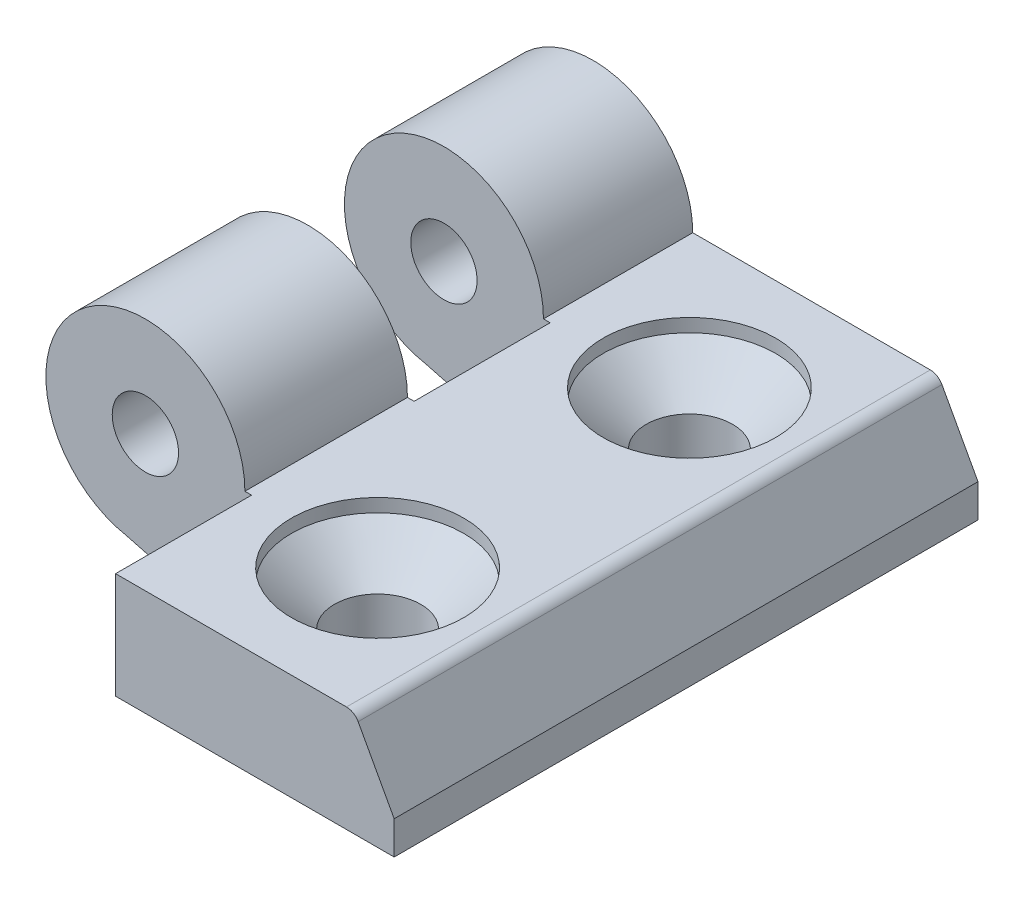
ISO-10303-21;
HEADER;
FILE_DESCRIPTION(('STEP AP214'),'2;1');
FILE_NAME('part.step','',(''),(''),'','','');
FILE_SCHEMA(('AUTOMOTIVE_DESIGN { 1 0 10303 214 1 1 1 1 }'));
ENDSEC;
DATA;
#1=APPLICATION_CONTEXT('core data for automotive mechanical design processes');
#2=APPLICATION_PROTOCOL_DEFINITION('international standard','automotive_design',2000,#1);
#3=PRODUCT_CONTEXT('',#1,'mechanical');
#4=PRODUCT('Part','Part','',(#3));
#5=PRODUCT_RELATED_PRODUCT_CATEGORY('part','',(#4));
#6=PRODUCT_DEFINITION_FORMATION('','',#4);
#7=PRODUCT_DEFINITION_CONTEXT('part definition',#1,'design');
#8=PRODUCT_DEFINITION('design','',#6,#7);
#9=PRODUCT_DEFINITION_SHAPE('','',#8);
#10=(LENGTH_UNIT() NAMED_UNIT(*) SI_UNIT(.MILLI.,.METRE.));
#11=(NAMED_UNIT(*) PLANE_ANGLE_UNIT() SI_UNIT($,.RADIAN.));
#12=(NAMED_UNIT(*) SI_UNIT($,.STERADIAN.) SOLID_ANGLE_UNIT());
#13=UNCERTAINTY_MEASURE_WITH_UNIT(LENGTH_MEASURE(1.E-05),#10,'distance_accuracy_value','');
#14=(GEOMETRIC_REPRESENTATION_CONTEXT(3) GLOBAL_UNCERTAINTY_ASSIGNED_CONTEXT((#13)) GLOBAL_UNIT_ASSIGNED_CONTEXT((#10,
#11,#12)) REPRESENTATION_CONTEXT('',''));
#15=CARTESIAN_POINT('',(0.,0.,0.));
#16=DIRECTION('',(0.,0.,1.));
#17=DIRECTION('',(1.,0.,0.));
#18=AXIS2_PLACEMENT_3D('',#15,#16,#17);
#19=CARTESIAN_POINT('',(0.,0.,22.));
#20=DIRECTION('',(0.,0.,-1.));
#21=DIRECTION('',(-1.,0.,0.));
#22=AXIS2_PLACEMENT_3D('',#19,#20,#21);
#23=CYLINDRICAL_SURFACE('',#22,7.5);
#24=DIRECTION('',(0.,0.,-1.));
#25=VECTOR('',#24,1.);
#26=CARTESIAN_POINT('',(7.5,0.,22.));
#27=LINE('',#26,#25);
#28=CARTESIAN_POINT('',(7.5,0.,11.75));
#29=VERTEX_POINT('',#28);
#30=CARTESIAN_POINT('',(7.5,0.,-0.5));
#31=VERTEX_POINT('',#30);
#32=EDGE_CURVE('E246',#29,#31,#27,.T.);
#33=ORIENTED_EDGE('',*,*,#32,.T.);
#34=CARTESIAN_POINT('',(0.,0.,-0.5));
#35=DIRECTION('',(0.,0.,1.));
#36=DIRECTION('',(1.,0.,0.));
#37=AXIS2_PLACEMENT_3D('',#34,#35,#36);
#38=CIRCLE('',#37,7.5);
#39=CARTESIAN_POINT('',(-1.3701417354685,-7.37378543386824,-0.5));
#40=VERTEX_POINT('',#39);
#41=EDGE_CURVE('E51',#31,#40,#38,.T.);
#42=ORIENTED_EDGE('',*,*,#41,.T.);
#43=DIRECTION('',(0.,0.,-1.));
#44=VECTOR('',#43,1.);
#45=CARTESIAN_POINT('',(-1.3701417354685,-7.37378543386824,22.));
#46=LINE('',#45,#44);
#47=CARTESIAN_POINT('',(-1.3701417354685,-7.37378543386824,11.75));
#48=VERTEX_POINT('',#47);
#49=EDGE_CURVE('E264',#48,#40,#46,.T.);
#50=ORIENTED_EDGE('',*,*,#49,.F.);
#51=CARTESIAN_POINT('',(0.,0.,11.75));
#52=DIRECTION('',(0.,0.,-1.));
#53=DIRECTION('',(-1.,0.,0.));
#54=AXIS2_PLACEMENT_3D('',#51,#52,#53);
#55=CIRCLE('',#54,7.5);
#56=EDGE_CURVE('E188',#48,#29,#55,.T.);
#57=ORIENTED_EDGE('',*,*,#56,.T.);
#58=EDGE_LOOP('',(#33,#42,#50,#57));
#59=FACE_BOUND('',#58,.T.);
#60=ADVANCED_FACE('F35',(#59),#23,.T.);
#61=CARTESIAN_POINT('',(1.,-8.,22.));
#62=DIRECTION('',(0.255444273782313,0.966823780733504,0.));
#63=DIRECTION('',(-0.966823780733504,0.255444273782313,0.));
#64=AXIS2_PLACEMENT_3D('',#61,#62,#63);
#65=PLANE('',#64);
#66=DIRECTION('',(0.,0.,-1.));
#67=VECTOR('',#66,1.);
#68=CARTESIAN_POINT('',(1.,-8.,22.));
#69=LINE('',#68,#67);
#70=CARTESIAN_POINT('',(1.,-8.00000000000001,-10.75));
#71=VERTEX_POINT('',#70);
#72=CARTESIAN_POINT('',(1.,-8.,-22.));
#73=VERTEX_POINT('',#72);
#74=EDGE_CURVE('E261',#71,#73,#69,.T.);
#75=ORIENTED_EDGE('',*,*,#74,.F.);
#76=DIRECTION('',(-0.966823780733504,0.255444273782313,0.));
#77=VECTOR('',#76,1.);
#78=CARTESIAN_POINT('',(1.,-8.,-10.75));
#79=LINE('',#78,#77);
#80=CARTESIAN_POINT('',(-1.3701417354685,-7.37378543386824,-10.75));
#81=VERTEX_POINT('',#80);
#82=EDGE_CURVE('E174',#71,#81,#79,.T.);
#83=ORIENTED_EDGE('',*,*,#82,.T.);
#84=CARTESIAN_POINT('',(-1.3701417354685,-7.37378543386824,-22.));
#85=VERTEX_POINT('',#84);
#86=EDGE_CURVE('E263',#81,#85,#46,.T.);
#87=ORIENTED_EDGE('',*,*,#86,.T.);
#88=DIRECTION('',(0.966823780733504,-0.255444273782313,0.));
#89=VECTOR('',#88,1.);
#90=CARTESIAN_POINT('',(1.,-8.,-22.));
#91=LINE('',#90,#89);
#92=EDGE_CURVE('E233',#85,#73,#91,.T.);
#93=ORIENTED_EDGE('',*,*,#92,.T.);
#94=EDGE_LOOP('',(#75,#83,#87,#93));
#95=FACE_BOUND('',#94,.T.);
#96=ADVANCED_FACE('F280',(#95),#65,.F.);
#97=CARTESIAN_POINT('',(0.,0.,-10.75));
#98=DIRECTION('',(0.,0.,-1.));
#99=DIRECTION('',(-1.,0.,0.));
#100=AXIS2_PLACEMENT_3D('',#97,#98,#99);
#101=CIRCLE('',#100,7.5);
#102=CARTESIAN_POINT('',(7.5,0.,-10.75));
#103=VERTEX_POINT('',#102);
#104=EDGE_CURVE('E172',#81,#103,#101,.T.);
#105=ORIENTED_EDGE('',*,*,#104,.T.);
#106=CARTESIAN_POINT('',(7.5,0.,-22.));
#107=VERTEX_POINT('',#106);
#108=EDGE_CURVE('E230',#103,#107,#27,.T.);
#109=ORIENTED_EDGE('',*,*,#108,.T.);
#110=CARTESIAN_POINT('',(0.,0.,-22.));
#111=DIRECTION('',(0.,0.,1.));
#112=DIRECTION('',(1.,0.,0.));
#113=AXIS2_PLACEMENT_3D('',#110,#111,#112);
#114=CIRCLE('',#113,7.5);
#115=EDGE_CURVE('E217',#107,#85,#114,.T.);
#116=ORIENTED_EDGE('',*,*,#115,.T.);
#117=ORIENTED_EDGE('',*,*,#86,.F.);
#118=EDGE_LOOP('',(#105,#109,#116,#117));
#119=FACE_BOUND('',#118,.T.);
#120=ADVANCED_FACE('F37',(#119),#23,.T.);
#121=ORIENTED_EDGE('',*,*,#49,.T.);
#122=DIRECTION('',(0.966823780733504,-0.255444273782313,0.));
#123=VECTOR('',#122,1.);
#124=CARTESIAN_POINT('',(1.,-8.,-0.5));
#125=LINE('',#124,#123);
#126=CARTESIAN_POINT('',(1.,-8.00000000000001,-0.5));
#127=VERTEX_POINT('',#126);
#128=EDGE_CURVE('E170',#40,#127,#125,.T.);
#129=ORIENTED_EDGE('',*,*,#128,.T.);
#130=CARTESIAN_POINT('',(1.,-8.00000000000001,11.75));
#131=VERTEX_POINT('',#130);
#132=EDGE_CURVE('E159',#131,#127,#69,.T.);
#133=ORIENTED_EDGE('',*,*,#132,.F.);
#134=DIRECTION('',(-0.966823780733504,0.255444273782313,0.));
#135=VECTOR('',#134,1.);
#136=CARTESIAN_POINT('',(1.,-8.,11.75));
#137=LINE('',#136,#135);
#138=EDGE_CURVE('E190',#131,#48,#137,.T.);
#139=ORIENTED_EDGE('',*,*,#138,.T.);
#140=EDGE_LOOP('',(#121,#129,#133,#139));
#141=FACE_BOUND('',#140,.T.);
#142=ADVANCED_FACE('F302',(#141),#65,.F.);
#143=CARTESIAN_POINT('',(29.,-8.,22.));
#144=DIRECTION('',(0.,1.,0.));
#145=DIRECTION('',(0.,0.,1.));
#146=AXIS2_PLACEMENT_3D('',#143,#144,#145);
#147=PLANE('',#146);
#148=CARTESIAN_POINT('',(17.5000000000001,-8.00000000000001,-11.75));
#149=DIRECTION('',(0.,-1.,0.));
#150=DIRECTION('',(0.,0.,-1.));
#151=AXIS2_PLACEMENT_3D('',#148,#149,#150);
#152=CIRCLE('',#151,3.24999999999998);
#153=CARTESIAN_POINT('',(17.5000000000001,-8.00000000000001,-15.));
#154=VERTEX_POINT('',#153);
#155=EDGE_CURVE('E199',#154,#154,#152,.T.);
#156=ORIENTED_EDGE('',*,*,#155,.F.);
#157=EDGE_LOOP('',(#156));
#158=FACE_BOUND('',#157,.T.);
#159=CARTESIAN_POINT('',(17.5000000000001,-8.00000000000001,11.75));
#160=DIRECTION('',(0.,-1.,0.));
#161=DIRECTION('',(0.,0.,-1.));
#162=AXIS2_PLACEMENT_3D('',#159,#160,#161);
#163=CIRCLE('',#162,3.24999999999998);
#164=CARTESIAN_POINT('',(17.5000000000001,-8.00000000000001,8.50000000000002));
#165=VERTEX_POINT('',#164);
#166=EDGE_CURVE('E211',#165,#165,#163,.T.);
#167=ORIENTED_EDGE('',*,*,#166,.F.);
#168=EDGE_LOOP('',(#167));
#169=FACE_BOUND('',#168,.T.);
#170=DIRECTION('',(0.,0.,-1.));
#171=VECTOR('',#170,1.);
#172=CARTESIAN_POINT('',(8.0035947720278,-8.00000000000001,-0.5));
#173=LINE('',#172,#171);
#174=CARTESIAN_POINT('',(8.0035947720278,-8.00000000000001,-0.5));
#175=VERTEX_POINT('',#174);
#176=CARTESIAN_POINT('',(8.0035947720278,-8.00000000000001,-10.75));
#177=VERTEX_POINT('',#176);
#178=EDGE_CURVE('E148',#175,#177,#173,.T.);
#179=ORIENTED_EDGE('',*,*,#178,.T.);
#180=DIRECTION('',(-1.,0.,0.));
#181=VECTOR('',#180,1.);
#182=CARTESIAN_POINT('',(-8.09730823188185,-8.00000000000001,-10.75));
#183=LINE('',#182,#181);
#184=EDGE_CURVE('E145',#177,#71,#183,.T.);
#185=ORIENTED_EDGE('',*,*,#184,.T.);
#186=ORIENTED_EDGE('',*,*,#74,.T.);
#187=DIRECTION('',(1.,0.,0.));
#188=VECTOR('',#187,1.);
#189=CARTESIAN_POINT('',(29.,-8.,-22.));
#190=LINE('',#189,#188);
#191=CARTESIAN_POINT('',(29.,-8.,-22.));
#192=VERTEX_POINT('',#191);
#193=EDGE_CURVE('E236',#73,#192,#190,.T.);
#194=ORIENTED_EDGE('',*,*,#193,.T.);
#195=DIRECTION('',(0.,0.,-1.));
#196=VECTOR('',#195,1.);
#197=CARTESIAN_POINT('',(29.,-8.,22.));
#198=LINE('',#197,#196);
#199=CARTESIAN_POINT('',(29.,-8.,22.));
#200=VERTEX_POINT('',#199);
#201=EDGE_CURVE('E258',#200,#192,#198,.T.);
#202=ORIENTED_EDGE('',*,*,#201,.F.);
#203=DIRECTION('',(1.,0.,0.));
#204=VECTOR('',#203,1.);
#205=CARTESIAN_POINT('',(29.,-8.,22.));
#206=LINE('',#205,#204);
#207=CARTESIAN_POINT('',(8.00359477202788,-8.,22.));
#208=VERTEX_POINT('',#207);
#209=EDGE_CURVE('E218',#208,#200,#206,.T.);
#210=ORIENTED_EDGE('',*,*,#209,.F.);
#211=DIRECTION('',(0.,0.,-1.));
#212=VECTOR('',#211,1.);
#213=CARTESIAN_POINT('',(8.00359477202788,-8.00000000000001,22.));
#214=LINE('',#213,#212);
#215=CARTESIAN_POINT('',(8.00359477202788,-8.00000000000001,11.75));
#216=VERTEX_POINT('',#215);
#217=EDGE_CURVE('E59',#208,#216,#214,.T.);
#218=ORIENTED_EDGE('',*,*,#217,.T.);
#219=DIRECTION('',(-1.,0.,0.));
#220=VECTOR('',#219,1.);
#221=CARTESIAN_POINT('',(-8.09730823188177,-8.00000000000001,11.75));
#222=LINE('',#221,#220);
#223=EDGE_CURVE('E178',#216,#131,#222,.T.);
#224=ORIENTED_EDGE('',*,*,#223,.T.);
#225=ORIENTED_EDGE('',*,*,#132,.T.);
#226=DIRECTION('',(1.,0.,0.));
#227=VECTOR('',#226,1.);
#228=CARTESIAN_POINT('',(-8.09730823188185,-8.00000000000001,-0.5));
#229=LINE('',#228,#227);
#230=EDGE_CURVE('E139',#127,#175,#229,.T.);
#231=ORIENTED_EDGE('',*,*,#230,.T.);
#232=EDGE_LOOP('',(#179,#185,#186,#194,#202,#210,#218,#224,#225,#231));
#233=FACE_BOUND('',#232,.T.);
#234=ADVANCED_FACE('F156',(#158,#169,#233),#147,.F.);
#235=CARTESIAN_POINT('',(29.,-5.5,22.));
#236=DIRECTION('',(-1.,0.,0.));
#237=DIRECTION('',(0.,0.,1.));
#238=AXIS2_PLACEMENT_3D('',#235,#236,#237);
#239=PLANE('',#238);
#240=DIRECTION('',(0.,1.,0.));
#241=VECTOR('',#240,1.);
#242=CARTESIAN_POINT('',(29.,-5.5,-22.));
#243=LINE('',#242,#241);
#244=CARTESIAN_POINT('',(29.,-5.5,-22.));
#245=VERTEX_POINT('',#244);
#246=EDGE_CURVE('E238',#192,#245,#243,.T.);
#247=ORIENTED_EDGE('',*,*,#246,.T.);
#248=DIRECTION('',(0.,0.,-1.));
#249=VECTOR('',#248,1.);
#250=CARTESIAN_POINT('',(29.,-5.5,22.));
#251=LINE('',#250,#249);
#252=CARTESIAN_POINT('',(29.,-5.5,22.));
#253=VERTEX_POINT('',#252);
#254=EDGE_CURVE('E255',#253,#245,#251,.T.);
#255=ORIENTED_EDGE('',*,*,#254,.F.);
#256=DIRECTION('',(0.,1.,0.));
#257=VECTOR('',#256,1.);
#258=CARTESIAN_POINT('',(29.,-5.5,22.));
#259=LINE('',#258,#257);
#260=EDGE_CURVE('E220',#200,#253,#259,.T.);
#261=ORIENTED_EDGE('',*,*,#260,.F.);
#262=ORIENTED_EDGE('',*,*,#201,.T.);
#263=EDGE_LOOP('',(#247,#255,#261,#262));
#264=FACE_BOUND('',#263,.T.);
#265=ADVANCED_FACE('F293',(#264),#239,.F.);
#266=CARTESIAN_POINT('',(29.,-5.5,22.));
#267=DIRECTION('',(-0.87789557291435,-0.478852130680636,0.));
#268=DIRECTION('',(0.478852130680636,-0.87789557291435,0.));
#269=AXIS2_PLACEMENT_3D('',#266,#267,#268);
#270=PLANE('',#269);
#271=DIRECTION('',(-0.478852130680636,0.87789557291435,0.));
#272=VECTOR('',#271,1.);
#273=CARTESIAN_POINT('',(29.,-5.5,-22.));
#274=LINE('',#273,#272);
#275=CARTESIAN_POINT('',(26.2842624741738,-0.521147869319435,-22.));
#276=VERTEX_POINT('',#275);
#277=EDGE_CURVE('E240',#245,#276,#274,.T.);
#278=ORIENTED_EDGE('',*,*,#277,.T.);
#279=DIRECTION('',(0.,0.,-1.));
#280=VECTOR('',#279,1.);
#281=CARTESIAN_POINT('',(26.2842624741738,-0.521147869319435,22.));
#282=LINE('',#281,#280);
#283=CARTESIAN_POINT('',(26.2842624741738,-0.521147869319435,22.));
#284=VERTEX_POINT('',#283);
#285=EDGE_CURVE('E252',#284,#276,#282,.T.);
#286=ORIENTED_EDGE('',*,*,#285,.F.);
#287=DIRECTION('',(-0.478852130680636,0.87789557291435,0.));
#288=VECTOR('',#287,1.);
#289=CARTESIAN_POINT('',(29.,-5.5,22.));
#290=LINE('',#289,#288);
#291=EDGE_CURVE('E223',#253,#284,#290,.T.);
#292=ORIENTED_EDGE('',*,*,#291,.F.);
#293=ORIENTED_EDGE('',*,*,#254,.T.);
#294=EDGE_LOOP('',(#278,#286,#292,#293));
#295=FACE_BOUND('',#294,.T.);
#296=ADVANCED_FACE('F338',(#295),#270,.F.);
#297=CARTESIAN_POINT('',(25.4063669012594,-1.,22.));
#298=DIRECTION('',(0.,0.,-1.));
#299=DIRECTION('',(-1.,0.,0.));
#300=AXIS2_PLACEMENT_3D('',#297,#298,#299);
#301=CYLINDRICAL_SURFACE('',#300,1.);
#302=CARTESIAN_POINT('',(25.4063669012594,-1.,-22.));
#303=DIRECTION('',(0.,0.,1.));
#304=DIRECTION('',(1.,0.,0.));
#305=AXIS2_PLACEMENT_3D('',#302,#303,#304);
#306=CIRCLE('',#305,1.);
#307=CARTESIAN_POINT('',(25.4063669012594,0.,-22.));
#308=VERTEX_POINT('',#307);
#309=EDGE_CURVE('E242',#276,#308,#306,.T.);
#310=ORIENTED_EDGE('',*,*,#309,.T.);
#311=DIRECTION('',(0.,0.,-1.));
#312=VECTOR('',#311,1.);
#313=CARTESIAN_POINT('',(25.4063669012594,0.,22.));
#314=LINE('',#313,#312);
#315=CARTESIAN_POINT('',(25.4063669012594,0.,22.));
#316=VERTEX_POINT('',#315);
#317=EDGE_CURVE('E249',#316,#308,#314,.T.);
#318=ORIENTED_EDGE('',*,*,#317,.F.);
#319=CARTESIAN_POINT('',(25.4063669012594,-1.,22.));
#320=DIRECTION('',(0.,0.,1.));
#321=DIRECTION('',(1.,0.,0.));
#322=AXIS2_PLACEMENT_3D('',#319,#320,#321);
#323=CIRCLE('',#322,1.);
#324=EDGE_CURVE('E225',#284,#316,#323,.T.);
#325=ORIENTED_EDGE('',*,*,#324,.F.);
#326=ORIENTED_EDGE('',*,*,#285,.T.);
#327=EDGE_LOOP('',(#310,#318,#325,#326));
#328=FACE_BOUND('',#327,.T.);
#329=ADVANCED_FACE('F336',(#328),#301,.T.);
#330=CARTESIAN_POINT('',(25.4063669012594,0.,22.));
#331=DIRECTION('',(0.,-1.,0.));
#332=DIRECTION('',(0.,0.,-1.));
#333=AXIS2_PLACEMENT_3D('',#330,#331,#332);
#334=PLANE('',#333);
#335=CARTESIAN_POINT('',(17.5000000000001,0.,-11.75));
#336=DIRECTION('',(0.,-1.,0.));
#337=DIRECTION('',(0.,0.,-1.));
#338=AXIS2_PLACEMENT_3D('',#335,#336,#337);
#339=CIRCLE('',#338,6.49999999999995);
#340=CARTESIAN_POINT('',(17.5000000000001,0.,-18.25));
#341=VERTEX_POINT('',#340);
#342=EDGE_CURVE('E202',#341,#341,#339,.T.);
#343=ORIENTED_EDGE('',*,*,#342,.T.);
#344=EDGE_LOOP('',(#343));
#345=FACE_BOUND('',#344,.T.);
#346=CARTESIAN_POINT('',(17.5000000000001,0.,11.75));
#347=DIRECTION('',(0.,-1.,0.));
#348=DIRECTION('',(0.,0.,-1.));
#349=AXIS2_PLACEMENT_3D('',#346,#347,#348);
#350=CIRCLE('',#349,6.49999999999995);
#351=CARTESIAN_POINT('',(17.5000000000001,0.,5.25000000000005));
#352=VERTEX_POINT('',#351);
#353=EDGE_CURVE('E214',#352,#352,#350,.T.);
#354=ORIENTED_EDGE('',*,*,#353,.T.);
#355=EDGE_LOOP('',(#354));
#356=FACE_BOUND('',#355,.T.);
#357=ORIENTED_EDGE('',*,*,#108,.F.);
#358=DIRECTION('',(1.,0.,0.));
#359=VECTOR('',#358,1.);
#360=CARTESIAN_POINT('',(25.4063669012594,0.,-10.75));
#361=LINE('',#360,#359);
#362=CARTESIAN_POINT('',(8.0035947720278,0.,-10.75));
#363=VERTEX_POINT('',#362);
#364=EDGE_CURVE('E11',#103,#363,#361,.T.);
#365=ORIENTED_EDGE('',*,*,#364,.T.);
#366=DIRECTION('',(0.,0.,1.));
#367=VECTOR('',#366,1.);
#368=CARTESIAN_POINT('',(8.0035947720278,0.,22.));
#369=LINE('',#368,#367);
#370=CARTESIAN_POINT('',(8.0035947720278,0.,-0.5));
#371=VERTEX_POINT('',#370);
#372=EDGE_CURVE('E44',#363,#371,#369,.T.);
#373=ORIENTED_EDGE('',*,*,#372,.T.);
#374=DIRECTION('',(-1.,0.,0.));
#375=VECTOR('',#374,1.);
#376=CARTESIAN_POINT('',(25.4063669012594,0.,-0.5));
#377=LINE('',#376,#375);
#378=EDGE_CURVE('E141',#371,#31,#377,.T.);
#379=ORIENTED_EDGE('',*,*,#378,.T.);
#380=ORIENTED_EDGE('',*,*,#32,.F.);
#381=DIRECTION('',(1.,0.,0.));
#382=VECTOR('',#381,1.);
#383=CARTESIAN_POINT('',(25.4063669012594,0.,11.75));
#384=LINE('',#383,#382);
#385=CARTESIAN_POINT('',(8.00359477202788,0.,11.75));
#386=VERTEX_POINT('',#385);
#387=EDGE_CURVE('E267',#29,#386,#384,.T.);
#388=ORIENTED_EDGE('',*,*,#387,.T.);
#389=DIRECTION('',(0.,0.,1.));
#390=VECTOR('',#389,1.);
#391=CARTESIAN_POINT('',(8.00359477202788,0.,22.));
#392=LINE('',#391,#390);
#393=CARTESIAN_POINT('',(8.00359477202788,0.,22.));
#394=VERTEX_POINT('',#393);
#395=EDGE_CURVE('E184',#386,#394,#392,.T.);
#396=ORIENTED_EDGE('',*,*,#395,.T.);
#397=DIRECTION('',(-1.,0.,0.));
#398=VECTOR('',#397,1.);
#399=CARTESIAN_POINT('',(25.4063669012594,0.,22.));
#400=LINE('',#399,#398);
#401=EDGE_CURVE('E227',#316,#394,#400,.T.);
#402=ORIENTED_EDGE('',*,*,#401,.F.);
#403=ORIENTED_EDGE('',*,*,#317,.T.);
#404=DIRECTION('',(-1.,0.,0.));
#405=VECTOR('',#404,1.);
#406=CARTESIAN_POINT('',(25.4063669012594,0.,-22.));
#407=LINE('',#406,#405);
#408=EDGE_CURVE('E221',#308,#107,#407,.T.);
#409=ORIENTED_EDGE('',*,*,#408,.T.);
#410=EDGE_LOOP('',(#357,#365,#373,#379,#380,#388,#396,#402,#403,#409));
#411=FACE_BOUND('',#410,.T.);
#412=ADVANCED_FACE('F273',(#345,#356,#411),#334,.F.);
#413=CARTESIAN_POINT('',(0.,0.,22.));
#414=DIRECTION('',(0.,0.,1.));
#415=DIRECTION('',(1.,0.,0.));
#416=AXIS2_PLACEMENT_3D('',#413,#414,#415);
#417=PLANE('',#416);
#418=DIRECTION('',(0.,1.,0.));
#419=VECTOR('',#418,1.);
#420=CARTESIAN_POINT('',(8.00359477202788,-8.00000000000001,22.));
#421=LINE('',#420,#419);
#422=EDGE_CURVE('E180',#208,#394,#421,.T.);
#423=ORIENTED_EDGE('',*,*,#422,.F.);
#424=ORIENTED_EDGE('',*,*,#209,.T.);
#425=ORIENTED_EDGE('',*,*,#260,.T.);
#426=ORIENTED_EDGE('',*,*,#291,.T.);
#427=ORIENTED_EDGE('',*,*,#324,.T.);
#428=ORIENTED_EDGE('',*,*,#401,.T.);
#429=EDGE_LOOP('',(#423,#424,#425,#426,#427,#428));
#430=FACE_BOUND('',#429,.T.);
#431=ADVANCED_FACE('F297',(#430),#417,.T.);
#432=CARTESIAN_POINT('',(0.,0.,-22.));
#433=DIRECTION('',(0.,0.,1.));
#434=DIRECTION('',(1.,0.,0.));
#435=AXIS2_PLACEMENT_3D('',#432,#433,#434);
#436=PLANE('',#435);
#437=CARTESIAN_POINT('',(0.,0.,-22.));
#438=DIRECTION('',(0.,0.,-1.));
#439=DIRECTION('',(-1.,0.,0.));
#440=AXIS2_PLACEMENT_3D('',#437,#438,#439);
#441=CIRCLE('',#440,2.5);
#442=CARTESIAN_POINT('',(-2.5,0.,-22.));
#443=VERTEX_POINT('',#442);
#444=EDGE_CURVE('E545',#443,#443,#441,.T.);
#445=ORIENTED_EDGE('',*,*,#444,.F.);
#446=EDGE_LOOP('',(#445));
#447=FACE_BOUND('',#446,.T.);
#448=ORIENTED_EDGE('',*,*,#115,.F.);
#449=ORIENTED_EDGE('',*,*,#408,.F.);
#450=ORIENTED_EDGE('',*,*,#309,.F.);
#451=ORIENTED_EDGE('',*,*,#277,.F.);
#452=ORIENTED_EDGE('',*,*,#246,.F.);
#453=ORIENTED_EDGE('',*,*,#193,.F.);
#454=ORIENTED_EDGE('',*,*,#92,.F.);
#455=EDGE_LOOP('',(#448,#449,#450,#451,#452,#453,#454));
#456=FACE_BOUND('',#455,.T.);
#457=ADVANCED_FACE('F287',(#447,#456),#436,.F.);
#458=CARTESIAN_POINT('',(17.5000000000001,-8.00000000000001,11.75));
#459=DIRECTION('',(0.,-1.,0.));
#460=DIRECTION('',(0.,0.,-1.));
#461=AXIS2_PLACEMENT_3D('',#458,#459,#460);
#462=CYLINDRICAL_SURFACE('',#461,6.49999999999995);
#463=ORIENTED_EDGE('',*,*,#353,.F.);
#464=EDGE_LOOP('',(#463));
#465=FACE_BOUND('',#464,.T.);
#466=CARTESIAN_POINT('',(17.5000000000001,-1.,11.75));
#467=DIRECTION('',(0.,-1.,0.));
#468=DIRECTION('',(0.,0.,-1.));
#469=AXIS2_PLACEMENT_3D('',#466,#467,#468);
#470=CIRCLE('',#469,6.49999999999995);
#471=CARTESIAN_POINT('',(17.5000000000001,-1.,5.25000000000005));
#472=VERTEX_POINT('',#471);
#473=EDGE_CURVE('E205',#472,#472,#470,.T.);
#474=ORIENTED_EDGE('',*,*,#473,.T.);
#475=EDGE_LOOP('',(#474));
#476=FACE_BOUND('',#475,.T.);
#477=ADVANCED_FACE('F361',(#465,#476),#462,.F.);
#478=CARTESIAN_POINT('',(17.5000000000001,-8.00000000000001,11.75));
#479=DIRECTION('',(0.,-1.,0.));
#480=DIRECTION('',(0.,0.,-1.));
#481=AXIS2_PLACEMENT_3D('',#478,#479,#480);
#482=CYLINDRICAL_SURFACE('',#481,3.24999999999998);
#483=CARTESIAN_POINT('',(17.5000000000001,-4.,11.75));
#484=DIRECTION('',(0.,-1.,0.));
#485=DIRECTION('',(0.,0.,-1.));
#486=AXIS2_PLACEMENT_3D('',#483,#484,#485);
#487=CIRCLE('',#486,3.24999999999998);
#488=CARTESIAN_POINT('',(17.5000000000001,-4.,8.50000000000002));
#489=VERTEX_POINT('',#488);
#490=EDGE_CURVE('E208',#489,#489,#487,.T.);
#491=ORIENTED_EDGE('',*,*,#490,.F.);
#492=EDGE_LOOP('',(#491));
#493=FACE_BOUND('',#492,.T.);
#494=ORIENTED_EDGE('',*,*,#166,.T.);
#495=EDGE_LOOP('',(#494));
#496=FACE_BOUND('',#495,.T.);
#497=ADVANCED_FACE('F358',(#493,#496),#482,.F.);
#498=CARTESIAN_POINT('',(17.5000000000001,-4.,11.75));
#499=DIRECTION('',(0.,1.,0.));
#500=DIRECTION('',(0.,0.,1.));
#501=AXIS2_PLACEMENT_3D('',#498,#499,#500);
#502=CONICAL_SURFACE('',#501,3.24999999999998,0.825376850520734);
#503=ORIENTED_EDGE('',*,*,#473,.F.);
#504=EDGE_LOOP('',(#503));
#505=FACE_BOUND('',#504,.T.);
#506=ORIENTED_EDGE('',*,*,#490,.T.);
#507=EDGE_LOOP('',(#506));
#508=FACE_BOUND('',#507,.T.);
#509=ADVANCED_FACE('F360',(#505,#508),#502,.F.);
#510=CARTESIAN_POINT('',(17.5000000000001,-8.00000000000001,-11.75));
#511=DIRECTION('',(0.,-1.,0.));
#512=DIRECTION('',(0.,0.,-1.));
#513=AXIS2_PLACEMENT_3D('',#510,#511,#512);
#514=CYLINDRICAL_SURFACE('',#513,6.49999999999995);
#515=ORIENTED_EDGE('',*,*,#342,.F.);
#516=EDGE_LOOP('',(#515));
#517=FACE_BOUND('',#516,.T.);
#518=CARTESIAN_POINT('',(17.5000000000001,-1.,-11.75));
#519=DIRECTION('',(0.,-1.,0.));
#520=DIRECTION('',(0.,0.,-1.));
#521=AXIS2_PLACEMENT_3D('',#518,#519,#520);
#522=CIRCLE('',#521,6.49999999999995);
#523=CARTESIAN_POINT('',(17.5000000000001,-1.,-18.25));
#524=VERTEX_POINT('',#523);
#525=EDGE_CURVE('E193',#524,#524,#522,.T.);
#526=ORIENTED_EDGE('',*,*,#525,.T.);
#527=EDGE_LOOP('',(#526));
#528=FACE_BOUND('',#527,.T.);
#529=ADVANCED_FACE('F368',(#517,#528),#514,.F.);
#530=CARTESIAN_POINT('',(17.5000000000001,-8.00000000000001,-11.75));
#531=DIRECTION('',(0.,-1.,0.));
#532=DIRECTION('',(0.,0.,-1.));
#533=AXIS2_PLACEMENT_3D('',#530,#531,#532);
#534=CYLINDRICAL_SURFACE('',#533,3.24999999999998);
#535=CARTESIAN_POINT('',(17.5000000000001,-4.,-11.75));
#536=DIRECTION('',(0.,-1.,0.));
#537=DIRECTION('',(0.,0.,-1.));
#538=AXIS2_PLACEMENT_3D('',#535,#536,#537);
#539=CIRCLE('',#538,3.24999999999998);
#540=CARTESIAN_POINT('',(17.5000000000001,-4.,-15.));
#541=VERTEX_POINT('',#540);
#542=EDGE_CURVE('E196',#541,#541,#539,.T.);
#543=ORIENTED_EDGE('',*,*,#542,.F.);
#544=EDGE_LOOP('',(#543));
#545=FACE_BOUND('',#544,.T.);
#546=ORIENTED_EDGE('',*,*,#155,.T.);
#547=EDGE_LOOP('',(#546));
#548=FACE_BOUND('',#547,.T.);
#549=ADVANCED_FACE('F392',(#545,#548),#534,.F.);
#550=CARTESIAN_POINT('',(17.5000000000001,-4.,-11.75));
#551=DIRECTION('',(0.,1.,0.));
#552=DIRECTION('',(0.,0.,1.));
#553=AXIS2_PLACEMENT_3D('',#550,#551,#552);
#554=CONICAL_SURFACE('',#553,3.24999999999998,0.825376850520734);
#555=ORIENTED_EDGE('',*,*,#525,.F.);
#556=EDGE_LOOP('',(#555));
#557=FACE_BOUND('',#556,.T.);
#558=ORIENTED_EDGE('',*,*,#542,.T.);
#559=EDGE_LOOP('',(#558));
#560=FACE_BOUND('',#559,.T.);
#561=ADVANCED_FACE('F317',(#557,#560),#554,.F.);
#562=CARTESIAN_POINT('',(-8.09730823188177,-8.00000000000001,11.75));
#563=DIRECTION('',(0.,0.,-1.));
#564=DIRECTION('',(-1.,0.,0.));
#565=AXIS2_PLACEMENT_3D('',#562,#563,#564);
#566=PLANE('',#565);
#567=CARTESIAN_POINT('',(0.,0.,11.75));
#568=DIRECTION('',(0.,0.,-1.));
#569=DIRECTION('',(-1.,0.,0.));
#570=AXIS2_PLACEMENT_3D('',#567,#568,#569);
#571=CIRCLE('',#570,2.5);
#572=CARTESIAN_POINT('',(-2.5,0.,11.75));
#573=VERTEX_POINT('',#572);
#574=EDGE_CURVE('E160',#573,#573,#571,.T.);
#575=ORIENTED_EDGE('',*,*,#574,.T.);
#576=EDGE_LOOP('',(#575));
#577=FACE_BOUND('',#576,.T.);
#578=ORIENTED_EDGE('',*,*,#223,.F.);
#579=DIRECTION('',(0.,1.,0.));
#580=VECTOR('',#579,1.);
#581=CARTESIAN_POINT('',(8.00359477202788,-8.00000000000001,11.75));
#582=LINE('',#581,#580);
#583=EDGE_CURVE('E181',#216,#386,#582,.T.);
#584=ORIENTED_EDGE('',*,*,#583,.T.);
#585=ORIENTED_EDGE('',*,*,#387,.F.);
#586=ORIENTED_EDGE('',*,*,#56,.F.);
#587=ORIENTED_EDGE('',*,*,#138,.F.);
#588=EDGE_LOOP('',(#578,#584,#585,#586,#587));
#589=FACE_BOUND('',#588,.T.);
#590=ADVANCED_FACE('F307',(#577,#589),#566,.F.);
#591=CARTESIAN_POINT('',(8.00359477202788,-8.00000000000001,22.));
#592=DIRECTION('',(1.,0.,0.));
#593=DIRECTION('',(0.,0.,-1.));
#594=AXIS2_PLACEMENT_3D('',#591,#592,#593);
#595=PLANE('',#594);
#596=ORIENTED_EDGE('',*,*,#583,.F.);
#597=ORIENTED_EDGE('',*,*,#217,.F.);
#598=ORIENTED_EDGE('',*,*,#422,.T.);
#599=ORIENTED_EDGE('',*,*,#395,.F.);
#600=EDGE_LOOP('',(#596,#597,#598,#599));
#601=FACE_BOUND('',#600,.T.);
#602=ADVANCED_FACE('F308',(#601),#595,.F.);
#603=CARTESIAN_POINT('',(-8.09730823188185,-8.00000000000001,-10.75));
#604=DIRECTION('',(0.,0.,-1.));
#605=DIRECTION('',(-1.,0.,0.));
#606=AXIS2_PLACEMENT_3D('',#603,#604,#605);
#607=PLANE('',#606);
#608=CARTESIAN_POINT('',(0.,0.,-10.75));
#609=DIRECTION('',(0.,0.,-1.));
#610=DIRECTION('',(-1.,0.,0.));
#611=AXIS2_PLACEMENT_3D('',#608,#609,#610);
#612=CIRCLE('',#611,2.5);
#613=CARTESIAN_POINT('',(-2.5,0.,-10.75));
#614=VERTEX_POINT('',#613);
#615=EDGE_CURVE('E163',#614,#614,#612,.T.);
#616=ORIENTED_EDGE('',*,*,#615,.T.);
#617=EDGE_LOOP('',(#616));
#618=FACE_BOUND('',#617,.T.);
#619=ORIENTED_EDGE('',*,*,#184,.F.);
#620=DIRECTION('',(0.,1.,0.));
#621=VECTOR('',#620,1.);
#622=CARTESIAN_POINT('',(8.0035947720278,-8.00000000000001,-10.75));
#623=LINE('',#622,#621);
#624=EDGE_CURVE('E144',#177,#363,#623,.T.);
#625=ORIENTED_EDGE('',*,*,#624,.T.);
#626=ORIENTED_EDGE('',*,*,#364,.F.);
#627=ORIENTED_EDGE('',*,*,#104,.F.);
#628=ORIENTED_EDGE('',*,*,#82,.F.);
#629=EDGE_LOOP('',(#619,#625,#626,#627,#628));
#630=FACE_BOUND('',#629,.T.);
#631=ADVANCED_FACE('F277',(#618,#630),#607,.F.);
#632=CARTESIAN_POINT('',(8.0035947720278,-8.00000000000001,-0.5));
#633=DIRECTION('',(1.,0.,0.));
#634=DIRECTION('',(0.,0.,-1.));
#635=AXIS2_PLACEMENT_3D('',#632,#633,#634);
#636=PLANE('',#635);
#637=ORIENTED_EDGE('',*,*,#624,.F.);
#638=ORIENTED_EDGE('',*,*,#178,.F.);
#639=DIRECTION('',(0.,1.,0.));
#640=VECTOR('',#639,1.);
#641=CARTESIAN_POINT('',(8.0035947720278,-8.00000000000001,-0.5));
#642=LINE('',#641,#640);
#643=EDGE_CURVE('E135',#175,#371,#642,.T.);
#644=ORIENTED_EDGE('',*,*,#643,.T.);
#645=ORIENTED_EDGE('',*,*,#372,.F.);
#646=EDGE_LOOP('',(#637,#638,#644,#645));
#647=FACE_BOUND('',#646,.T.);
#648=ADVANCED_FACE('F149',(#647),#636,.F.);
#649=CARTESIAN_POINT('',(-8.09730823188185,-8.00000000000001,-0.5));
#650=DIRECTION('',(0.,0.,1.));
#651=DIRECTION('',(1.,0.,0.));
#652=AXIS2_PLACEMENT_3D('',#649,#650,#651);
#653=PLANE('',#652);
#654=CARTESIAN_POINT('',(0.,0.,-0.5));
#655=DIRECTION('',(0.,0.,1.));
#656=DIRECTION('',(1.,0.,0.));
#657=AXIS2_PLACEMENT_3D('',#654,#655,#656);
#658=CIRCLE('',#657,2.5);
#659=CARTESIAN_POINT('',(2.5,0.,-0.5));
#660=VERTEX_POINT('',#659);
#661=EDGE_CURVE('E39',#660,#660,#658,.T.);
#662=ORIENTED_EDGE('',*,*,#661,.T.);
#663=EDGE_LOOP('',(#662));
#664=FACE_BOUND('',#663,.T.);
#665=ORIENTED_EDGE('',*,*,#41,.F.);
#666=ORIENTED_EDGE('',*,*,#378,.F.);
#667=ORIENTED_EDGE('',*,*,#643,.F.);
#668=ORIENTED_EDGE('',*,*,#230,.F.);
#669=ORIENTED_EDGE('',*,*,#128,.F.);
#670=EDGE_LOOP('',(#665,#666,#667,#668,#669));
#671=FACE_BOUND('',#670,.T.);
#672=ADVANCED_FACE('F137',(#664,#671),#653,.F.);
#673=CARTESIAN_POINT('',(0.,0.,22.));
#674=DIRECTION('',(0.,0.,-1.));
#675=DIRECTION('',(-1.,0.,0.));
#676=AXIS2_PLACEMENT_3D('',#673,#674,#675);
#677=CYLINDRICAL_SURFACE('',#676,2.5);
#678=ORIENTED_EDGE('',*,*,#661,.F.);
#679=EDGE_LOOP('',(#678));
#680=FACE_BOUND('',#679,.T.);
#681=ORIENTED_EDGE('',*,*,#574,.F.);
#682=EDGE_LOOP('',(#681));
#683=FACE_BOUND('',#682,.T.);
#684=ADVANCED_FACE('F443',(#680,#683),#677,.F.);
#685=ORIENTED_EDGE('',*,*,#444,.T.);
#686=EDGE_LOOP('',(#685));
#687=FACE_BOUND('',#686,.T.);
#688=ORIENTED_EDGE('',*,*,#615,.F.);
#689=EDGE_LOOP('',(#688));
#690=FACE_BOUND('',#689,.T.);
#691=ADVANCED_FACE('F453',(#687,#690),#677,.F.);
#692=CLOSED_SHELL('',(#60,#96,#120,#142,#234,#265,#296,#329,#412,#431,#457,#477,#497,#509,#529,
#549,#561,#590,#602,#631,#648,#672,#684,#691));
#693=MANIFOLD_SOLID_BREP('B2',#692);
#694=ADVANCED_BREP_SHAPE_REPRESENTATION('',(#18,#693),#14);
#695=SHAPE_DEFINITION_REPRESENTATION(#9,#694);
ENDSEC;
END-ISO-10303-21;
